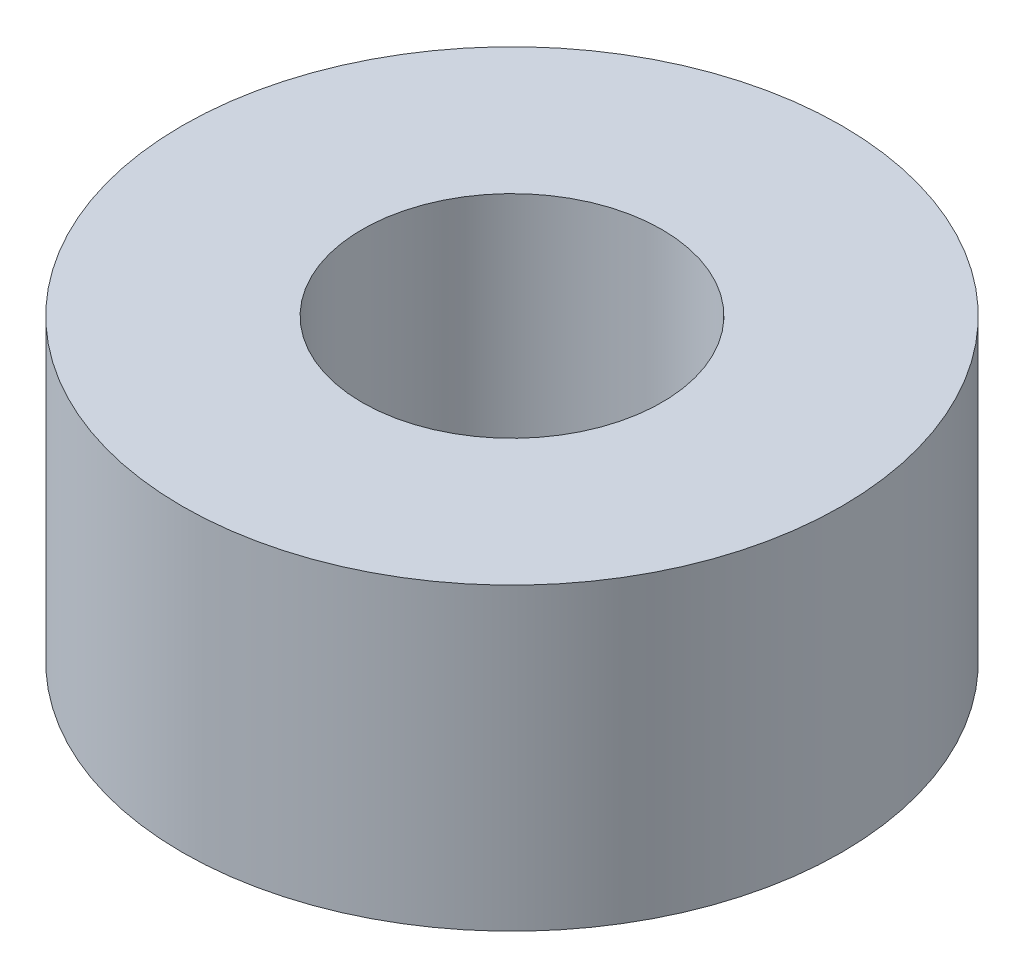
ISO-10303-21;
HEADER;
FILE_DESCRIPTION(('STEP AP214'),'2;1');
FILE_NAME('part.step','',(''),(''),'','','');
FILE_SCHEMA(('AUTOMOTIVE_DESIGN { 1 0 10303 214 1 1 1 1 }'));
ENDSEC;
DATA;
#1=APPLICATION_CONTEXT('core data for automotive mechanical design processes');
#2=APPLICATION_PROTOCOL_DEFINITION('international standard','automotive_design',2000,#1);
#3=PRODUCT_CONTEXT('',#1,'mechanical');
#4=PRODUCT('Part','Part','',(#3));
#5=PRODUCT_RELATED_PRODUCT_CATEGORY('part','',(#4));
#6=PRODUCT_DEFINITION_FORMATION('','',#4);
#7=PRODUCT_DEFINITION_CONTEXT('part definition',#1,'design');
#8=PRODUCT_DEFINITION('design','',#6,#7);
#9=PRODUCT_DEFINITION_SHAPE('','',#8);
#10=(LENGTH_UNIT() NAMED_UNIT(*) SI_UNIT(.MILLI.,.METRE.));
#11=(NAMED_UNIT(*) PLANE_ANGLE_UNIT() SI_UNIT($,.RADIAN.));
#12=(NAMED_UNIT(*) SI_UNIT($,.STERADIAN.) SOLID_ANGLE_UNIT());
#13=UNCERTAINTY_MEASURE_WITH_UNIT(LENGTH_MEASURE(1.E-05),#10,'distance_accuracy_value','');
#14=(GEOMETRIC_REPRESENTATION_CONTEXT(3) GLOBAL_UNCERTAINTY_ASSIGNED_CONTEXT((#13)) GLOBAL_UNIT_ASSIGNED_CONTEXT((#10,
#11,#12)) REPRESENTATION_CONTEXT('',''));
#15=CARTESIAN_POINT('',(0.,0.,0.));
#16=DIRECTION('',(0.,0.,1.));
#17=DIRECTION('',(1.,0.,0.));
#18=AXIS2_PLACEMENT_3D('',#15,#16,#17);
#19=CARTESIAN_POINT('',(0.,3.96875,0.));
#20=DIRECTION('',(0.,1.,0.));
#21=DIRECTION('',(0.,0.,1.));
#22=AXIS2_PLACEMENT_3D('',#19,#20,#21);
#23=PLANE('',#22);
#24=CARTESIAN_POINT('',(0.,3.96875,0.));
#25=DIRECTION('',(0.,1.,0.));
#26=DIRECTION('',(0.,0.,1.));
#27=AXIS2_PLACEMENT_3D('',#24,#25,#26);
#28=CIRCLE('',#27,8.73125);
#29=CARTESIAN_POINT('',(0.,3.96875,8.73125));
#30=VERTEX_POINT('',#29);
#31=EDGE_CURVE('E11',#30,#30,#28,.T.);
#32=ORIENTED_EDGE('',*,*,#31,.T.);
#33=EDGE_LOOP('',(#32));
#34=FACE_BOUND('',#33,.T.);
#35=CARTESIAN_POINT('',(0.,3.96875,0.));
#36=DIRECTION('',(0.,1.,0.));
#37=DIRECTION('',(0.,0.,1.));
#38=AXIS2_PLACEMENT_3D('',#35,#36,#37);
#39=CIRCLE('',#38,3.96875);
#40=CARTESIAN_POINT('',(0.,3.96875,3.96875));
#41=VERTEX_POINT('',#40);
#42=EDGE_CURVE('E56',#41,#41,#39,.T.);
#43=ORIENTED_EDGE('',*,*,#42,.F.);
#44=EDGE_LOOP('',(#43));
#45=FACE_BOUND('',#44,.T.);
#46=ADVANCED_FACE('F43',(#34,#45),#23,.T.);
#47=CARTESIAN_POINT('',(0.,-3.96875,0.));
#48=DIRECTION('',(0.,1.,0.));
#49=DIRECTION('',(0.,0.,1.));
#50=AXIS2_PLACEMENT_3D('',#47,#48,#49);
#51=PLANE('',#50);
#52=CARTESIAN_POINT('',(0.,-3.96875,0.));
#53=DIRECTION('',(0.,1.,0.));
#54=DIRECTION('',(0.,0.,1.));
#55=AXIS2_PLACEMENT_3D('',#52,#53,#54);
#56=CIRCLE('',#55,8.73125);
#57=CARTESIAN_POINT('',(0.,-3.96875,8.73125));
#58=VERTEX_POINT('',#57);
#59=EDGE_CURVE('E47',#58,#58,#56,.T.);
#60=ORIENTED_EDGE('',*,*,#59,.F.);
#61=EDGE_LOOP('',(#60));
#62=FACE_BOUND('',#61,.T.);
#63=CARTESIAN_POINT('',(0.,-3.96875,0.));
#64=DIRECTION('',(0.,1.,0.));
#65=DIRECTION('',(0.,0.,1.));
#66=AXIS2_PLACEMENT_3D('',#63,#64,#65);
#67=CIRCLE('',#66,3.96875);
#68=CARTESIAN_POINT('',(0.,-3.96875,3.96875));
#69=VERTEX_POINT('',#68);
#70=EDGE_CURVE('E58',#69,#69,#67,.T.);
#71=ORIENTED_EDGE('',*,*,#70,.T.);
#72=EDGE_LOOP('',(#71));
#73=FACE_BOUND('',#72,.T.);
#74=ADVANCED_FACE('F70',(#62,#73),#51,.F.);
#75=CARTESIAN_POINT('',(0.,3.96875,0.));
#76=DIRECTION('',(0.,-1.,0.));
#77=DIRECTION('',(0.,0.,-1.));
#78=AXIS2_PLACEMENT_3D('',#75,#76,#77);
#79=CYLINDRICAL_SURFACE('',#78,8.73125);
#80=ORIENTED_EDGE('',*,*,#31,.F.);
#81=EDGE_LOOP('',(#80));
#82=FACE_BOUND('',#81,.T.);
#83=ORIENTED_EDGE('',*,*,#59,.T.);
#84=EDGE_LOOP('',(#83));
#85=FACE_BOUND('',#84,.T.);
#86=ADVANCED_FACE('F45',(#82,#85),#79,.T.);
#87=CARTESIAN_POINT('',(0.,3.96875,0.));
#88=DIRECTION('',(0.,-1.,0.));
#89=DIRECTION('',(0.,0.,-1.));
#90=AXIS2_PLACEMENT_3D('',#87,#88,#89);
#91=CYLINDRICAL_SURFACE('',#90,3.96875);
#92=ORIENTED_EDGE('',*,*,#42,.T.);
#93=EDGE_LOOP('',(#92));
#94=FACE_BOUND('',#93,.T.);
#95=ORIENTED_EDGE('',*,*,#70,.F.);
#96=EDGE_LOOP('',(#95));
#97=FACE_BOUND('',#96,.T.);
#98=ADVANCED_FACE('F66',(#94,#97),#91,.F.);
#99=CLOSED_SHELL('',(#46,#74,#86,#98));
#100=MANIFOLD_SOLID_BREP('B2',#99);
#101=ADVANCED_BREP_SHAPE_REPRESENTATION('',(#18,#100),#14);
#102=SHAPE_DEFINITION_REPRESENTATION(#9,#101);
ENDSEC;
END-ISO-10303-21;
